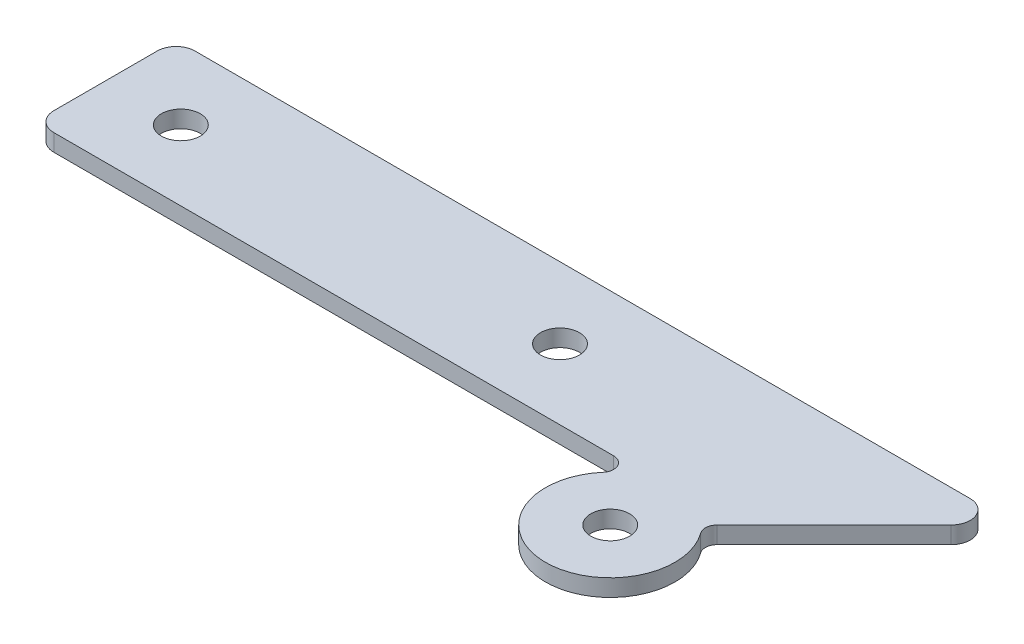
ISO-10303-21;
HEADER;
FILE_DESCRIPTION(('STEP AP214'),'2;1');
FILE_NAME('part.step','',(''),(''),'','','');
FILE_SCHEMA(('AUTOMOTIVE_DESIGN { 1 0 10303 214 1 1 1 1 }'));
ENDSEC;
DATA;
#1=APPLICATION_CONTEXT('core data for automotive mechanical design processes');
#2=APPLICATION_PROTOCOL_DEFINITION('international standard','automotive_design',2000,#1);
#3=PRODUCT_CONTEXT('',#1,'mechanical');
#4=PRODUCT('Part','Part','',(#3));
#5=PRODUCT_RELATED_PRODUCT_CATEGORY('part','',(#4));
#6=PRODUCT_DEFINITION_FORMATION('','',#4);
#7=PRODUCT_DEFINITION_CONTEXT('part definition',#1,'design');
#8=PRODUCT_DEFINITION('design','',#6,#7);
#9=PRODUCT_DEFINITION_SHAPE('','',#8);
#10=(LENGTH_UNIT() NAMED_UNIT(*) SI_UNIT(.MILLI.,.METRE.));
#11=(NAMED_UNIT(*) PLANE_ANGLE_UNIT() SI_UNIT($,.RADIAN.));
#12=(NAMED_UNIT(*) SI_UNIT($,.STERADIAN.) SOLID_ANGLE_UNIT());
#13=UNCERTAINTY_MEASURE_WITH_UNIT(LENGTH_MEASURE(1.E-05),#10,'distance_accuracy_value','');
#14=(GEOMETRIC_REPRESENTATION_CONTEXT(3) GLOBAL_UNCERTAINTY_ASSIGNED_CONTEXT((#13)) GLOBAL_UNIT_ASSIGNED_CONTEXT((#10,
#11,#12)) REPRESENTATION_CONTEXT('',''));
#15=CARTESIAN_POINT('',(0.,0.,0.));
#16=DIRECTION('',(0.,0.,1.));
#17=DIRECTION('',(1.,0.,0.));
#18=AXIS2_PLACEMENT_3D('',#15,#16,#17);
#19=CARTESIAN_POINT('',(44.4503952922486,2.286,17.653));
#20=DIRECTION('',(0.,1.,0.));
#21=DIRECTION('',(0.,0.,1.));
#22=AXIS2_PLACEMENT_3D('',#19,#20,#21);
#23=PLANE('',#22);
#24=DIRECTION('',(1.,0.,0.));
#25=VECTOR('',#24,1.);
#26=CARTESIAN_POINT('',(41.7867538355206,2.286,9.39799999999999));
#27=LINE('',#26,#25);
#28=CARTESIAN_POINT('',(36.6500825863374,2.286,9.39799999999999));
#29=VERTEX_POINT('',#28);
#30=CARTESIAN_POINT('',(-38.3536047077515,2.286,9.398));
#31=VERTEX_POINT('',#30);
#32=EDGE_CURVE('E119',#29,#31,#27,.F.);
#33=ORIENTED_EDGE('',*,*,#32,.F.);
#34=CARTESIAN_POINT('',(36.6500825863374,2.286,10.9855));
#35=DIRECTION('',(0.,1.,0.));
#36=DIRECTION('',(0.,0.,1.));
#37=AXIS2_PLACEMENT_3D('',#34,#35,#36);
#38=CIRCLE('',#37,1.5875);
#39=CARTESIAN_POINT('',(37.8568141311875,2.286,12.0169820544554));
#40=VERTEX_POINT('',#39);
#41=EDGE_CURVE('E160',#29,#40,#38,.F.);
#42=ORIENTED_EDGE('',*,*,#41,.T.);
#43=CARTESIAN_POINT('',(44.4503952922486,2.286,17.653));
#44=DIRECTION('',(0.,1.,0.));
#45=DIRECTION('',(0.,0.,1.));
#46=AXIS2_PLACEMENT_3D('',#43,#44,#45);
#47=CIRCLE('',#46,8.6741);
#48=CARTESIAN_POINT('',(51.4589419807747,2.286,12.5421992677517));
#49=VERTEX_POINT('',#48);
#50=EDGE_CURVE('E157',#49,#40,#47,.F.);
#51=ORIENTED_EDGE('',*,*,#50,.F.);
#52=CARTESIAN_POINT('',(52.7416189003439,2.286,11.6068404221719));
#53=DIRECTION('',(0.,1.,0.));
#54=DIRECTION('',(0.,0.,1.));
#55=AXIS2_PLACEMENT_3D('',#52,#53,#54);
#56=CIRCLE('',#55,1.5875);
#57=CARTESIAN_POINT('',(51.6190868852103,2.286,10.4843084070383));
#58=VERTEX_POINT('',#57);
#59=EDGE_CURVE('E118',#49,#58,#56,.F.);
#60=ORIENTED_EDGE('',*,*,#59,.T.);
#61=DIRECTION('',(0.707106781186546,0.,-0.707106781186549));
#62=VECTOR('',#61,1.);
#63=CARTESIAN_POINT('',(50.5839102229388,2.286,11.5194850693097));
#64=LINE('',#63,#62);
#65=CARTESIAN_POINT('',(67.2923440680347,2.286,-5.18894877578618));
#66=VERTEX_POINT('',#65);
#67=EDGE_CURVE('E95',#66,#58,#64,.F.);
#68=ORIENTED_EDGE('',*,*,#67,.F.);
#69=CARTESIAN_POINT('',(65.4962928438209,2.286,-6.985));
#70=DIRECTION('',(0.,1.,0.));
#71=DIRECTION('',(0.,0.,1.));
#72=AXIS2_PLACEMENT_3D('',#69,#70,#71);
#73=CIRCLE('',#72,2.54);
#74=CARTESIAN_POINT('',(65.4962928438209,2.286,-9.525));
#75=VERTEX_POINT('',#74);
#76=EDGE_CURVE('E89',#75,#66,#73,.F.);
#77=ORIENTED_EDGE('',*,*,#76,.F.);
#78=DIRECTION('',(-1.,0.,0.));
#79=VECTOR('',#78,1.);
#80=CARTESIAN_POINT('',(-40.8936047077515,2.286,-9.525));
#81=LINE('',#80,#79);
#82=CARTESIAN_POINT('',(-38.3536047077515,2.286,-9.525));
#83=VERTEX_POINT('',#82);
#84=EDGE_CURVE('E92',#83,#75,#81,.F.);
#85=ORIENTED_EDGE('',*,*,#84,.F.);
#86=CARTESIAN_POINT('',(-38.3536047077515,2.286,-6.985));
#87=DIRECTION('',(0.,1.,0.));
#88=DIRECTION('',(0.,0.,1.));
#89=AXIS2_PLACEMENT_3D('',#86,#87,#88);
#90=CIRCLE('',#89,2.54);
#91=CARTESIAN_POINT('',(-40.8936047077515,2.286,-6.985));
#92=VERTEX_POINT('',#91);
#93=EDGE_CURVE('E166',#92,#83,#90,.F.);
#94=ORIENTED_EDGE('',*,*,#93,.F.);
#95=DIRECTION('',(0.,0.,1.));
#96=VECTOR('',#95,1.);
#97=CARTESIAN_POINT('',(-40.8936047077515,2.286,9.398));
#98=LINE('',#97,#96);
#99=CARTESIAN_POINT('',(-40.8936047077515,2.286,6.858));
#100=VERTEX_POINT('',#99);
#101=EDGE_CURVE('E123',#100,#92,#98,.F.);
#102=ORIENTED_EDGE('',*,*,#101,.F.);
#103=CARTESIAN_POINT('',(-38.3536047077515,2.286,6.858));
#104=DIRECTION('',(0.,1.,0.));
#105=DIRECTION('',(0.,0.,1.));
#106=AXIS2_PLACEMENT_3D('',#103,#104,#105);
#107=CIRCLE('',#106,2.54);
#108=EDGE_CURVE('E122',#31,#100,#107,.F.);
#109=ORIENTED_EDGE('',*,*,#108,.F.);
#110=EDGE_LOOP('',(#33,#42,#51,#60,#68,#77,#85,#94,#102,#109));
#111=FACE_BOUND('',#110,.T.);
#112=CARTESIAN_POINT('',(-30.734,2.286,0.));
#113=DIRECTION('',(0.,1.,0.));
#114=DIRECTION('',(0.,0.,1.));
#115=AXIS2_PLACEMENT_3D('',#112,#113,#114);
#116=CIRCLE('',#115,2.6035);
#117=CARTESIAN_POINT('',(-30.734,2.286,2.6035));
#118=VERTEX_POINT('',#117);
#119=EDGE_CURVE('E101',#118,#118,#116,.F.);
#120=ORIENTED_EDGE('',*,*,#119,.T.);
#121=EDGE_LOOP('',(#120));
#122=FACE_BOUND('',#121,.T.);
#123=CARTESIAN_POINT('',(20.066,2.286,0.));
#124=DIRECTION('',(0.,1.,0.));
#125=DIRECTION('',(0.,0.,1.));
#126=AXIS2_PLACEMENT_3D('',#123,#124,#125);
#127=CIRCLE('',#126,2.6035);
#128=CARTESIAN_POINT('',(20.066,2.286,2.6035));
#129=VERTEX_POINT('',#128);
#130=EDGE_CURVE('E169',#129,#129,#127,.F.);
#131=ORIENTED_EDGE('',*,*,#130,.T.);
#132=EDGE_LOOP('',(#131));
#133=FACE_BOUND('',#132,.T.);
#134=CARTESIAN_POINT('',(44.4503952922486,2.286,17.653));
#135=DIRECTION('',(0.,1.,0.));
#136=DIRECTION('',(0.,0.,1.));
#137=AXIS2_PLACEMENT_3D('',#134,#135,#136);
#138=CIRCLE('',#137,2.6035);
#139=CARTESIAN_POINT('',(44.4503952922486,2.286,20.2565));
#140=VERTEX_POINT('',#139);
#141=EDGE_CURVE('E19',#140,#140,#138,.F.);
#142=ORIENTED_EDGE('',*,*,#141,.T.);
#143=EDGE_LOOP('',(#142));
#144=FACE_BOUND('',#143,.T.);
#145=ADVANCED_FACE('F16',(#111,#122,#133,#144),#23,.T.);
#146=CARTESIAN_POINT('',(44.4503952922486,2.286,17.653));
#147=DIRECTION('',(0.,1.,0.));
#148=DIRECTION('',(0.,0.,1.));
#149=AXIS2_PLACEMENT_3D('',#146,#147,#148);
#150=CYLINDRICAL_SURFACE('',#149,2.6035);
#151=CARTESIAN_POINT('',(44.4503952922486,0.,17.653));
#152=DIRECTION('',(0.,1.,0.));
#153=DIRECTION('',(0.,0.,1.));
#154=AXIS2_PLACEMENT_3D('',#151,#152,#153);
#155=CIRCLE('',#154,2.6035);
#156=CARTESIAN_POINT('',(44.4503952922486,0.,20.2565));
#157=VERTEX_POINT('',#156);
#158=EDGE_CURVE('E151',#157,#157,#155,.F.);
#159=ORIENTED_EDGE('',*,*,#158,.T.);
#160=EDGE_LOOP('',(#159));
#161=FACE_BOUND('',#160,.T.);
#162=ORIENTED_EDGE('',*,*,#141,.F.);
#163=EDGE_LOOP('',(#162));
#164=FACE_BOUND('',#163,.T.);
#165=ADVANCED_FACE('F177',(#161,#164),#150,.F.);
#166=CARTESIAN_POINT('',(20.066,2.286,0.));
#167=DIRECTION('',(0.,1.,0.));
#168=DIRECTION('',(0.,0.,1.));
#169=AXIS2_PLACEMENT_3D('',#166,#167,#168);
#170=CYLINDRICAL_SURFACE('',#169,2.6035);
#171=CARTESIAN_POINT('',(20.066,0.,0.));
#172=DIRECTION('',(0.,1.,0.));
#173=DIRECTION('',(0.,0.,1.));
#174=AXIS2_PLACEMENT_3D('',#171,#172,#173);
#175=CIRCLE('',#174,2.6035);
#176=CARTESIAN_POINT('',(20.066,0.,2.6035));
#177=VERTEX_POINT('',#176);
#178=EDGE_CURVE('E148',#177,#177,#175,.F.);
#179=ORIENTED_EDGE('',*,*,#178,.T.);
#180=EDGE_LOOP('',(#179));
#181=FACE_BOUND('',#180,.T.);
#182=ORIENTED_EDGE('',*,*,#130,.F.);
#183=EDGE_LOOP('',(#182));
#184=FACE_BOUND('',#183,.T.);
#185=ADVANCED_FACE('F179',(#181,#184),#170,.F.);
#186=CARTESIAN_POINT('',(-30.734,2.286,0.));
#187=DIRECTION('',(0.,1.,0.));
#188=DIRECTION('',(0.,0.,1.));
#189=AXIS2_PLACEMENT_3D('',#186,#187,#188);
#190=CYLINDRICAL_SURFACE('',#189,2.6035);
#191=CARTESIAN_POINT('',(-30.734,0.,0.));
#192=DIRECTION('',(0.,1.,0.));
#193=DIRECTION('',(0.,0.,1.));
#194=AXIS2_PLACEMENT_3D('',#191,#192,#193);
#195=CIRCLE('',#194,2.6035);
#196=CARTESIAN_POINT('',(-30.734,0.,2.6035));
#197=VERTEX_POINT('',#196);
#198=EDGE_CURVE('E145',#197,#197,#195,.F.);
#199=ORIENTED_EDGE('',*,*,#198,.T.);
#200=EDGE_LOOP('',(#199));
#201=FACE_BOUND('',#200,.T.);
#202=ORIENTED_EDGE('',*,*,#119,.F.);
#203=EDGE_LOOP('',(#202));
#204=FACE_BOUND('',#203,.T.);
#205=ADVANCED_FACE('F186',(#201,#204),#190,.F.);
#206=CARTESIAN_POINT('',(65.4962928438209,2.286,-6.985));
#207=DIRECTION('',(0.,1.,0.));
#208=DIRECTION('',(0.,0.,1.));
#209=AXIS2_PLACEMENT_3D('',#206,#207,#208);
#210=CYLINDRICAL_SURFACE('',#209,2.54);
#211=ORIENTED_EDGE('',*,*,#76,.T.);
#212=DIRECTION('',(0.,1.,0.));
#213=VECTOR('',#212,1.);
#214=CARTESIAN_POINT('',(67.2923440680347,2.286,-5.18894877578618));
#215=LINE('',#214,#213);
#216=CARTESIAN_POINT('',(67.2923440680347,0.,-5.18894877578618));
#217=VERTEX_POINT('',#216);
#218=EDGE_CURVE('E154',#217,#66,#215,.T.);
#219=ORIENTED_EDGE('',*,*,#218,.F.);
#220=CARTESIAN_POINT('',(65.4962928438209,0.,-6.985));
#221=DIRECTION('',(0.,1.,0.));
#222=DIRECTION('',(0.,0.,1.));
#223=AXIS2_PLACEMENT_3D('',#220,#221,#222);
#224=CIRCLE('',#223,2.54);
#225=CARTESIAN_POINT('',(65.4962928438209,0.,-9.525));
#226=VERTEX_POINT('',#225);
#227=EDGE_CURVE('E112',#217,#226,#224,.T.);
#228=ORIENTED_EDGE('',*,*,#227,.T.);
#229=DIRECTION('',(0.,1.,0.));
#230=VECTOR('',#229,1.);
#231=CARTESIAN_POINT('',(65.4962928438209,2.286,-9.525));
#232=LINE('',#231,#230);
#233=EDGE_CURVE('E100',#75,#226,#232,.F.);
#234=ORIENTED_EDGE('',*,*,#233,.F.);
#235=EDGE_LOOP('',(#211,#219,#228,#234));
#236=FACE_BOUND('',#235,.T.);
#237=ADVANCED_FACE('F111',(#236),#210,.T.);
#238=CARTESIAN_POINT('',(-40.8936047077515,2.286,-9.525));
#239=DIRECTION('',(0.,0.,-1.));
#240=DIRECTION('',(-1.,0.,0.));
#241=AXIS2_PLACEMENT_3D('',#238,#239,#240);
#242=PLANE('',#241);
#243=DIRECTION('',(0.,1.,0.));
#244=VECTOR('',#243,1.);
#245=CARTESIAN_POINT('',(-38.3536047077515,2.286,-9.525));
#246=LINE('',#245,#244);
#247=CARTESIAN_POINT('',(-38.3536047077515,0.,-9.525));
#248=VERTEX_POINT('',#247);
#249=EDGE_CURVE('E108',#83,#248,#246,.F.);
#250=ORIENTED_EDGE('',*,*,#249,.F.);
#251=ORIENTED_EDGE('',*,*,#84,.T.);
#252=ORIENTED_EDGE('',*,*,#233,.T.);
#253=DIRECTION('',(1.,0.,0.));
#254=VECTOR('',#253,1.);
#255=CARTESIAN_POINT('',(44.4503952922486,0.,-9.525));
#256=LINE('',#255,#254);
#257=EDGE_CURVE('E143',#226,#248,#256,.F.);
#258=ORIENTED_EDGE('',*,*,#257,.T.);
#259=EDGE_LOOP('',(#250,#251,#252,#258));
#260=FACE_BOUND('',#259,.T.);
#261=ADVANCED_FACE('F105',(#260),#242,.T.);
#262=CARTESIAN_POINT('',(-38.3536047077515,2.286,-6.985));
#263=DIRECTION('',(0.,1.,0.));
#264=DIRECTION('',(0.,0.,1.));
#265=AXIS2_PLACEMENT_3D('',#262,#263,#264);
#266=CYLINDRICAL_SURFACE('',#265,2.54);
#267=DIRECTION('',(0.,1.,0.));
#268=VECTOR('',#267,1.);
#269=CARTESIAN_POINT('',(-40.8936047077515,2.286,-6.985));
#270=LINE('',#269,#268);
#271=CARTESIAN_POINT('',(-40.8936047077515,0.,-6.985));
#272=VERTEX_POINT('',#271);
#273=EDGE_CURVE('E126',#92,#272,#270,.F.);
#274=ORIENTED_EDGE('',*,*,#273,.F.);
#275=ORIENTED_EDGE('',*,*,#93,.T.);
#276=ORIENTED_EDGE('',*,*,#249,.T.);
#277=CARTESIAN_POINT('',(-38.3536047077515,0.,-6.985));
#278=DIRECTION('',(0.,1.,0.));
#279=DIRECTION('',(0.,0.,1.));
#280=AXIS2_PLACEMENT_3D('',#277,#278,#279);
#281=CIRCLE('',#280,2.54);
#282=EDGE_CURVE('E140',#248,#272,#281,.T.);
#283=ORIENTED_EDGE('',*,*,#282,.T.);
#284=EDGE_LOOP('',(#274,#275,#276,#283));
#285=FACE_BOUND('',#284,.T.);
#286=ADVANCED_FACE('F224',(#285),#266,.T.);
#287=CARTESIAN_POINT('',(-40.8936047077515,2.286,9.398));
#288=DIRECTION('',(-1.,0.,0.));
#289=DIRECTION('',(0.,0.,1.));
#290=AXIS2_PLACEMENT_3D('',#287,#288,#289);
#291=PLANE('',#290);
#292=DIRECTION('',(0.,1.,0.));
#293=VECTOR('',#292,1.);
#294=CARTESIAN_POINT('',(-40.8936047077515,2.286,6.858));
#295=LINE('',#294,#293);
#296=CARTESIAN_POINT('',(-40.8936047077515,0.,6.858));
#297=VERTEX_POINT('',#296);
#298=EDGE_CURVE('E125',#100,#297,#295,.F.);
#299=ORIENTED_EDGE('',*,*,#298,.F.);
#300=ORIENTED_EDGE('',*,*,#101,.T.);
#301=ORIENTED_EDGE('',*,*,#273,.T.);
#302=DIRECTION('',(0.,0.,1.));
#303=VECTOR('',#302,1.);
#304=CARTESIAN_POINT('',(-40.8936047077515,0.,17.653));
#305=LINE('',#304,#303);
#306=EDGE_CURVE('E139',#272,#297,#305,.T.);
#307=ORIENTED_EDGE('',*,*,#306,.T.);
#308=EDGE_LOOP('',(#299,#300,#301,#307));
#309=FACE_BOUND('',#308,.T.);
#310=ADVANCED_FACE('F220',(#309),#291,.T.);
#311=CARTESIAN_POINT('',(-38.3536047077515,2.286,6.858));
#312=DIRECTION('',(0.,1.,0.));
#313=DIRECTION('',(0.,0.,1.));
#314=AXIS2_PLACEMENT_3D('',#311,#312,#313);
#315=CYLINDRICAL_SURFACE('',#314,2.54);
#316=DIRECTION('',(0.,1.,0.));
#317=VECTOR('',#316,1.);
#318=CARTESIAN_POINT('',(-38.3536047077515,2.286,9.398));
#319=LINE('',#318,#317);
#320=CARTESIAN_POINT('',(-38.3536047077515,0.,9.398));
#321=VERTEX_POINT('',#320);
#322=EDGE_CURVE('E121',#31,#321,#319,.F.);
#323=ORIENTED_EDGE('',*,*,#322,.F.);
#324=ORIENTED_EDGE('',*,*,#108,.T.);
#325=ORIENTED_EDGE('',*,*,#298,.T.);
#326=CARTESIAN_POINT('',(-38.3536047077515,0.,6.858));
#327=DIRECTION('',(0.,1.,0.));
#328=DIRECTION('',(0.,0.,1.));
#329=AXIS2_PLACEMENT_3D('',#326,#327,#328);
#330=CIRCLE('',#329,2.54);
#331=EDGE_CURVE('E136',#297,#321,#330,.T.);
#332=ORIENTED_EDGE('',*,*,#331,.T.);
#333=EDGE_LOOP('',(#323,#324,#325,#332));
#334=FACE_BOUND('',#333,.T.);
#335=ADVANCED_FACE('F216',(#334),#315,.T.);
#336=CARTESIAN_POINT('',(41.7867538355206,2.286,9.39799999999999));
#337=DIRECTION('',(0.,0.,1.));
#338=DIRECTION('',(1.,0.,0.));
#339=AXIS2_PLACEMENT_3D('',#336,#337,#338);
#340=PLANE('',#339);
#341=ORIENTED_EDGE('',*,*,#32,.T.);
#342=ORIENTED_EDGE('',*,*,#322,.T.);
#343=DIRECTION('',(1.,0.,0.));
#344=VECTOR('',#343,1.);
#345=CARTESIAN_POINT('',(44.4503952922486,0.,9.398));
#346=LINE('',#345,#344);
#347=CARTESIAN_POINT('',(36.6500825863374,0.,9.398));
#348=VERTEX_POINT('',#347);
#349=EDGE_CURVE('E135',#321,#348,#346,.T.);
#350=ORIENTED_EDGE('',*,*,#349,.T.);
#351=DIRECTION('',(0.,1.,0.));
#352=VECTOR('',#351,1.);
#353=CARTESIAN_POINT('',(36.6500825863374,2.286,9.39799999999999));
#354=LINE('',#353,#352);
#355=EDGE_CURVE('E163',#348,#29,#354,.T.);
#356=ORIENTED_EDGE('',*,*,#355,.T.);
#357=EDGE_LOOP('',(#341,#342,#350,#356));
#358=FACE_BOUND('',#357,.T.);
#359=ADVANCED_FACE('F212',(#358),#340,.T.);
#360=CARTESIAN_POINT('',(36.6500825863374,2.286,10.9855));
#361=DIRECTION('',(0.,1.,0.));
#362=DIRECTION('',(0.,0.,1.));
#363=AXIS2_PLACEMENT_3D('',#360,#361,#362);
#364=CYLINDRICAL_SURFACE('',#363,1.5875);
#365=DIRECTION('',(0.,1.,0.));
#366=VECTOR('',#365,1.);
#367=CARTESIAN_POINT('',(37.8568141311875,2.286,12.0169820544554));
#368=LINE('',#367,#366);
#369=CARTESIAN_POINT('',(37.8568141311875,0.,12.0169820544554));
#370=VERTEX_POINT('',#369);
#371=EDGE_CURVE('E159',#40,#370,#368,.F.);
#372=ORIENTED_EDGE('',*,*,#371,.F.);
#373=ORIENTED_EDGE('',*,*,#41,.F.);
#374=ORIENTED_EDGE('',*,*,#355,.F.);
#375=CARTESIAN_POINT('',(36.6500825863374,0.,10.9855));
#376=DIRECTION('',(0.,1.,0.));
#377=DIRECTION('',(0.,0.,1.));
#378=AXIS2_PLACEMENT_3D('',#375,#376,#377);
#379=CIRCLE('',#378,1.5875);
#380=EDGE_CURVE('E132',#348,#370,#379,.F.);
#381=ORIENTED_EDGE('',*,*,#380,.T.);
#382=EDGE_LOOP('',(#372,#373,#374,#381));
#383=FACE_BOUND('',#382,.T.);
#384=ADVANCED_FACE('F208',(#383),#364,.F.);
#385=CARTESIAN_POINT('',(44.4503952922486,2.286,17.653));
#386=DIRECTION('',(0.,1.,0.));
#387=DIRECTION('',(0.,0.,1.));
#388=AXIS2_PLACEMENT_3D('',#385,#386,#387);
#389=CYLINDRICAL_SURFACE('',#388,8.6741);
#390=DIRECTION('',(0.,1.,0.));
#391=VECTOR('',#390,1.);
#392=CARTESIAN_POINT('',(51.4589419807747,2.286,12.5421992677517));
#393=LINE('',#392,#391);
#394=CARTESIAN_POINT('',(51.4589419807747,0.,12.5421992677517));
#395=VERTEX_POINT('',#394);
#396=EDGE_CURVE('E156',#395,#49,#393,.T.);
#397=ORIENTED_EDGE('',*,*,#396,.T.);
#398=ORIENTED_EDGE('',*,*,#50,.T.);
#399=ORIENTED_EDGE('',*,*,#371,.T.);
#400=CARTESIAN_POINT('',(44.4503952922486,0.,17.653));
#401=DIRECTION('',(0.,1.,0.));
#402=DIRECTION('',(0.,0.,1.));
#403=AXIS2_PLACEMENT_3D('',#400,#401,#402);
#404=CIRCLE('',#403,8.6741);
#405=EDGE_CURVE('E130',#370,#395,#404,.T.);
#406=ORIENTED_EDGE('',*,*,#405,.T.);
#407=EDGE_LOOP('',(#397,#398,#399,#406));
#408=FACE_BOUND('',#407,.T.);
#409=ADVANCED_FACE('F204',(#408),#389,.T.);
#410=CARTESIAN_POINT('',(52.7416189003439,2.286,11.6068404221719));
#411=DIRECTION('',(0.,1.,0.));
#412=DIRECTION('',(0.,0.,1.));
#413=AXIS2_PLACEMENT_3D('',#410,#411,#412);
#414=CYLINDRICAL_SURFACE('',#413,1.5875);
#415=DIRECTION('',(0.,1.,0.));
#416=VECTOR('',#415,1.);
#417=CARTESIAN_POINT('',(51.6190868852103,2.286,10.4843084070383));
#418=LINE('',#417,#416);
#419=CARTESIAN_POINT('',(51.6190868852103,0.,10.4843084070383));
#420=VERTEX_POINT('',#419);
#421=EDGE_CURVE('E33',#58,#420,#418,.F.);
#422=ORIENTED_EDGE('',*,*,#421,.F.);
#423=ORIENTED_EDGE('',*,*,#59,.F.);
#424=ORIENTED_EDGE('',*,*,#396,.F.);
#425=CARTESIAN_POINT('',(52.7416189003439,0.,11.6068404221719));
#426=DIRECTION('',(0.,1.,0.));
#427=DIRECTION('',(0.,0.,1.));
#428=AXIS2_PLACEMENT_3D('',#425,#426,#427);
#429=CIRCLE('',#428,1.5875);
#430=EDGE_CURVE('E25',#395,#420,#429,.F.);
#431=ORIENTED_EDGE('',*,*,#430,.T.);
#432=EDGE_LOOP('',(#422,#423,#424,#431));
#433=FACE_BOUND('',#432,.T.);
#434=ADVANCED_FACE('F197',(#433),#414,.F.);
#435=CARTESIAN_POINT('',(50.5839102229388,2.286,11.5194850693097));
#436=DIRECTION('',(0.707106781186549,0.,0.707106781186546));
#437=DIRECTION('',(0.707106781186546,0.,-0.707106781186549));
#438=AXIS2_PLACEMENT_3D('',#435,#436,#437);
#439=PLANE('',#438);
#440=DIRECTION('',(0.707106781186546,0.,-0.707106781186549));
#441=VECTOR('',#440,1.);
#442=CARTESIAN_POINT('',(51.6190868852103,0.,10.4843084070383));
#443=LINE('',#442,#441);
#444=EDGE_CURVE('E10',#420,#217,#443,.T.);
#445=ORIENTED_EDGE('',*,*,#444,.T.);
#446=ORIENTED_EDGE('',*,*,#218,.T.);
#447=ORIENTED_EDGE('',*,*,#67,.T.);
#448=ORIENTED_EDGE('',*,*,#421,.T.);
#449=EDGE_LOOP('',(#445,#446,#447,#448));
#450=FACE_BOUND('',#449,.T.);
#451=ADVANCED_FACE('F191',(#450),#439,.T.);
#452=CARTESIAN_POINT('',(44.4503952922486,0.,17.653));
#453=DIRECTION('',(0.,1.,0.));
#454=DIRECTION('',(0.,0.,1.));
#455=AXIS2_PLACEMENT_3D('',#452,#453,#454);
#456=PLANE('',#455);
#457=ORIENTED_EDGE('',*,*,#430,.F.);
#458=ORIENTED_EDGE('',*,*,#405,.F.);
#459=ORIENTED_EDGE('',*,*,#380,.F.);
#460=ORIENTED_EDGE('',*,*,#349,.F.);
#461=ORIENTED_EDGE('',*,*,#331,.F.);
#462=ORIENTED_EDGE('',*,*,#306,.F.);
#463=ORIENTED_EDGE('',*,*,#282,.F.);
#464=ORIENTED_EDGE('',*,*,#257,.F.);
#465=ORIENTED_EDGE('',*,*,#227,.F.);
#466=ORIENTED_EDGE('',*,*,#444,.F.);
#467=EDGE_LOOP('',(#457,#458,#459,#460,#461,#462,#463,#464,#465,#466));
#468=FACE_BOUND('',#467,.T.);
#469=ORIENTED_EDGE('',*,*,#198,.F.);
#470=EDGE_LOOP('',(#469));
#471=FACE_BOUND('',#470,.T.);
#472=ORIENTED_EDGE('',*,*,#178,.F.);
#473=EDGE_LOOP('',(#472));
#474=FACE_BOUND('',#473,.T.);
#475=ORIENTED_EDGE('',*,*,#158,.F.);
#476=EDGE_LOOP('',(#475));
#477=FACE_BOUND('',#476,.T.);
#478=ADVANCED_FACE('F189',(#468,#471,#474,#477),#456,.F.);
#479=CLOSED_SHELL('',(#145,#165,#185,#205,#237,#261,#286,#310,#335,#359,#384,#409,#434,#451,#478));
#480=MANIFOLD_SOLID_BREP('B1',#479);
#481=ADVANCED_BREP_SHAPE_REPRESENTATION('',(#18,#480),#14);
#482=SHAPE_DEFINITION_REPRESENTATION(#9,#481);
ENDSEC;
END-ISO-10303-21;
